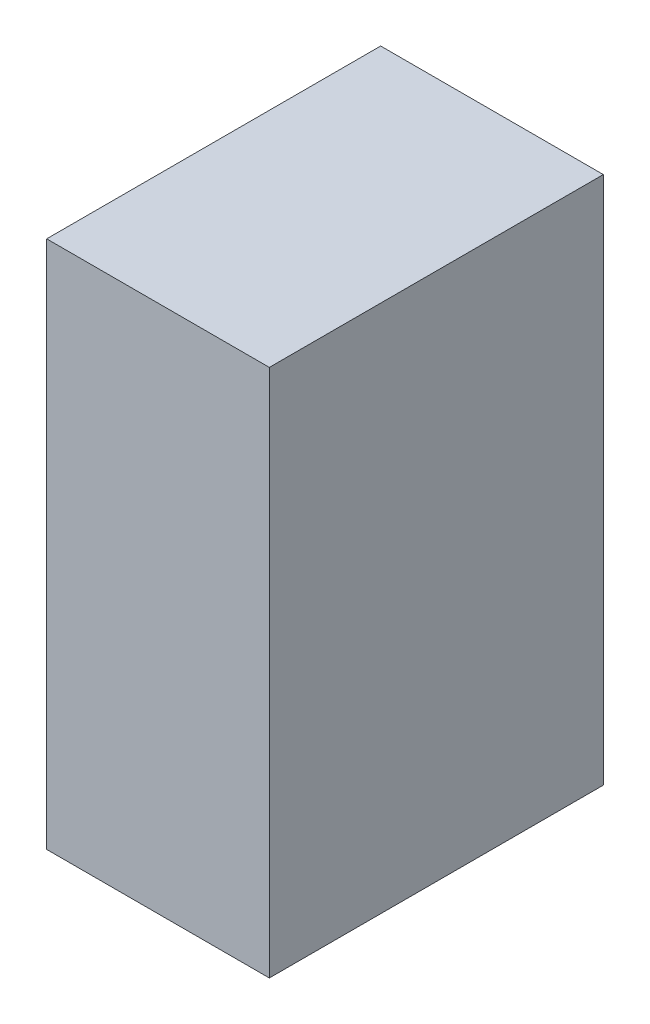
ISO-10303-21;
HEADER;
FILE_DESCRIPTION(('STEP AP214'),'2;1');
FILE_NAME('part.step','',(''),(''),'','','');
FILE_SCHEMA(('AUTOMOTIVE_DESIGN { 1 0 10303 214 1 1 1 1 }'));
ENDSEC;
DATA;
#1=APPLICATION_CONTEXT('core data for automotive mechanical design processes');
#2=APPLICATION_PROTOCOL_DEFINITION('international standard','automotive_design',2000,#1);
#3=PRODUCT_CONTEXT('',#1,'mechanical');
#4=PRODUCT('Part','Part','',(#3));
#5=PRODUCT_RELATED_PRODUCT_CATEGORY('part','',(#4));
#6=PRODUCT_DEFINITION_FORMATION('','',#4);
#7=PRODUCT_DEFINITION_CONTEXT('part definition',#1,'design');
#8=PRODUCT_DEFINITION('design','',#6,#7);
#9=PRODUCT_DEFINITION_SHAPE('','',#8);
#10=(LENGTH_UNIT() NAMED_UNIT(*) SI_UNIT(.MILLI.,.METRE.));
#11=(NAMED_UNIT(*) PLANE_ANGLE_UNIT() SI_UNIT($,.RADIAN.));
#12=(NAMED_UNIT(*) SI_UNIT($,.STERADIAN.) SOLID_ANGLE_UNIT());
#13=UNCERTAINTY_MEASURE_WITH_UNIT(LENGTH_MEASURE(1.E-05),#10,'distance_accuracy_value','');
#14=(GEOMETRIC_REPRESENTATION_CONTEXT(3) GLOBAL_UNCERTAINTY_ASSIGNED_CONTEXT((#13)) GLOBAL_UNIT_ASSIGNED_CONTEXT((#10,
#11,#12)) REPRESENTATION_CONTEXT('',''));
#15=CARTESIAN_POINT('',(0.,0.,0.));
#16=DIRECTION('',(0.,0.,1.));
#17=DIRECTION('',(1.,0.,0.));
#18=AXIS2_PLACEMENT_3D('',#15,#16,#17);
#19=CARTESIAN_POINT('',(-4.,19.,6.));
#20=DIRECTION('',(1.,0.,0.));
#21=DIRECTION('',(0.,0.,-1.));
#22=AXIS2_PLACEMENT_3D('',#19,#20,#21);
#23=PLANE('',#22);
#24=DIRECTION('',(0.,0.,1.));
#25=VECTOR('',#24,1.);
#26=CARTESIAN_POINT('',(-4.,0.,6.));
#27=LINE('',#26,#25);
#28=CARTESIAN_POINT('',(-4.,0.,-6.));
#29=VERTEX_POINT('',#28);
#30=CARTESIAN_POINT('',(-4.,0.,6.));
#31=VERTEX_POINT('',#30);
#32=EDGE_CURVE('E95',#29,#31,#27,.T.);
#33=ORIENTED_EDGE('',*,*,#32,.T.);
#34=DIRECTION('',(0.,-1.,0.));
#35=VECTOR('',#34,1.);
#36=CARTESIAN_POINT('',(-4.,19.,6.));
#37=LINE('',#36,#35);
#38=CARTESIAN_POINT('',(-4.,19.,6.));
#39=VERTEX_POINT('',#38);
#40=EDGE_CURVE('E11',#39,#31,#37,.T.);
#41=ORIENTED_EDGE('',*,*,#40,.F.);
#42=DIRECTION('',(0.,0.,1.));
#43=VECTOR('',#42,1.);
#44=CARTESIAN_POINT('',(-4.,19.,6.));
#45=LINE('',#44,#43);
#46=CARTESIAN_POINT('',(-4.,19.,-6.));
#47=VERTEX_POINT('',#46);
#48=EDGE_CURVE('E83',#47,#39,#45,.T.);
#49=ORIENTED_EDGE('',*,*,#48,.F.);
#50=DIRECTION('',(0.,-1.,0.));
#51=VECTOR('',#50,1.);
#52=CARTESIAN_POINT('',(-4.,19.,-6.));
#53=LINE('',#52,#51);
#54=EDGE_CURVE('E91',#47,#29,#53,.T.);
#55=ORIENTED_EDGE('',*,*,#54,.T.);
#56=EDGE_LOOP('',(#33,#41,#49,#55));
#57=FACE_BOUND('',#56,.T.);
#58=ADVANCED_FACE('F32',(#57),#23,.F.);
#59=CARTESIAN_POINT('',(4.,19.,6.));
#60=DIRECTION('',(0.,0.,-1.));
#61=DIRECTION('',(-1.,0.,0.));
#62=AXIS2_PLACEMENT_3D('',#59,#60,#61);
#63=PLANE('',#62);
#64=DIRECTION('',(1.,0.,0.));
#65=VECTOR('',#64,1.);
#66=CARTESIAN_POINT('',(4.,0.,6.));
#67=LINE('',#66,#65);
#68=CARTESIAN_POINT('',(4.,0.,6.));
#69=VERTEX_POINT('',#68);
#70=EDGE_CURVE('E87',#31,#69,#67,.T.);
#71=ORIENTED_EDGE('',*,*,#70,.T.);
#72=DIRECTION('',(0.,-1.,0.));
#73=VECTOR('',#72,1.);
#74=CARTESIAN_POINT('',(4.,19.,6.));
#75=LINE('',#74,#73);
#76=CARTESIAN_POINT('',(4.,19.,6.));
#77=VERTEX_POINT('',#76);
#78=EDGE_CURVE('E40',#77,#69,#75,.T.);
#79=ORIENTED_EDGE('',*,*,#78,.F.);
#80=DIRECTION('',(1.,0.,0.));
#81=VECTOR('',#80,1.);
#82=CARTESIAN_POINT('',(4.,19.,6.));
#83=LINE('',#82,#81);
#84=EDGE_CURVE('E78',#39,#77,#83,.T.);
#85=ORIENTED_EDGE('',*,*,#84,.F.);
#86=ORIENTED_EDGE('',*,*,#40,.T.);
#87=EDGE_LOOP('',(#71,#79,#85,#86));
#88=FACE_BOUND('',#87,.T.);
#89=ADVANCED_FACE('F86',(#88),#63,.F.);
#90=CARTESIAN_POINT('',(4.,19.,6.));
#91=DIRECTION('',(-1.,0.,0.));
#92=DIRECTION('',(0.,0.,1.));
#93=AXIS2_PLACEMENT_3D('',#90,#91,#92);
#94=PLANE('',#93);
#95=DIRECTION('',(0.,0.,-1.));
#96=VECTOR('',#95,1.);
#97=CARTESIAN_POINT('',(4.,0.,6.));
#98=LINE('',#97,#96);
#99=CARTESIAN_POINT('',(4.,0.,-6.));
#100=VERTEX_POINT('',#99);
#101=EDGE_CURVE('E65',#69,#100,#98,.T.);
#102=ORIENTED_EDGE('',*,*,#101,.T.);
#103=DIRECTION('',(0.,-1.,0.));
#104=VECTOR('',#103,1.);
#105=CARTESIAN_POINT('',(4.,19.,-6.));
#106=LINE('',#105,#104);
#107=CARTESIAN_POINT('',(4.,19.,-6.));
#108=VERTEX_POINT('',#107);
#109=EDGE_CURVE('E88',#108,#100,#106,.T.);
#110=ORIENTED_EDGE('',*,*,#109,.F.);
#111=DIRECTION('',(0.,0.,-1.));
#112=VECTOR('',#111,1.);
#113=CARTESIAN_POINT('',(4.,19.,6.));
#114=LINE('',#113,#112);
#115=EDGE_CURVE('E81',#77,#108,#114,.T.);
#116=ORIENTED_EDGE('',*,*,#115,.F.);
#117=ORIENTED_EDGE('',*,*,#78,.T.);
#118=EDGE_LOOP('',(#102,#110,#116,#117));
#119=FACE_BOUND('',#118,.T.);
#120=ADVANCED_FACE('F89',(#119),#94,.F.);
#121=CARTESIAN_POINT('',(4.,19.,-6.));
#122=DIRECTION('',(0.,0.,1.));
#123=DIRECTION('',(1.,0.,0.));
#124=AXIS2_PLACEMENT_3D('',#121,#122,#123);
#125=PLANE('',#124);
#126=DIRECTION('',(-1.,0.,0.));
#127=VECTOR('',#126,1.);
#128=CARTESIAN_POINT('',(4.,0.,-6.));
#129=LINE('',#128,#127);
#130=EDGE_CURVE('E71',#100,#29,#129,.T.);
#131=ORIENTED_EDGE('',*,*,#130,.T.);
#132=ORIENTED_EDGE('',*,*,#54,.F.);
#133=DIRECTION('',(-1.,0.,0.));
#134=VECTOR('',#133,1.);
#135=CARTESIAN_POINT('',(4.,19.,-6.));
#136=LINE('',#135,#134);
#137=EDGE_CURVE('E48',#108,#47,#136,.T.);
#138=ORIENTED_EDGE('',*,*,#137,.F.);
#139=ORIENTED_EDGE('',*,*,#109,.T.);
#140=EDGE_LOOP('',(#131,#132,#138,#139));
#141=FACE_BOUND('',#140,.T.);
#142=ADVANCED_FACE('F102',(#141),#125,.F.);
#143=CARTESIAN_POINT('',(0.,19.,0.));
#144=DIRECTION('',(0.,1.,0.));
#145=DIRECTION('',(0.,0.,1.));
#146=AXIS2_PLACEMENT_3D('',#143,#144,#145);
#147=PLANE('',#146);
#148=ORIENTED_EDGE('',*,*,#48,.T.);
#149=ORIENTED_EDGE('',*,*,#84,.T.);
#150=ORIENTED_EDGE('',*,*,#115,.T.);
#151=ORIENTED_EDGE('',*,*,#137,.T.);
#152=EDGE_LOOP('',(#148,#149,#150,#151));
#153=FACE_BOUND('',#152,.T.);
#154=ADVANCED_FACE('F79',(#153),#147,.T.);
#155=CARTESIAN_POINT('',(0.,0.,0.));
#156=DIRECTION('',(0.,1.,0.));
#157=DIRECTION('',(0.,0.,1.));
#158=AXIS2_PLACEMENT_3D('',#155,#156,#157);
#159=PLANE('',#158);
#160=ORIENTED_EDGE('',*,*,#32,.F.);
#161=ORIENTED_EDGE('',*,*,#130,.F.);
#162=ORIENTED_EDGE('',*,*,#101,.F.);
#163=ORIENTED_EDGE('',*,*,#70,.F.);
#164=EDGE_LOOP('',(#160,#161,#162,#163));
#165=FACE_BOUND('',#164,.T.);
#166=ADVANCED_FACE('F105',(#165),#159,.F.);
#167=CLOSED_SHELL('',(#58,#89,#120,#142,#154,#166));
#168=MANIFOLD_SOLID_BREP('B2',#167);
#169=ADVANCED_BREP_SHAPE_REPRESENTATION('',(#18,#168),#14);
#170=SHAPE_DEFINITION_REPRESENTATION(#9,#169);
ENDSEC;
END-ISO-10303-21;
